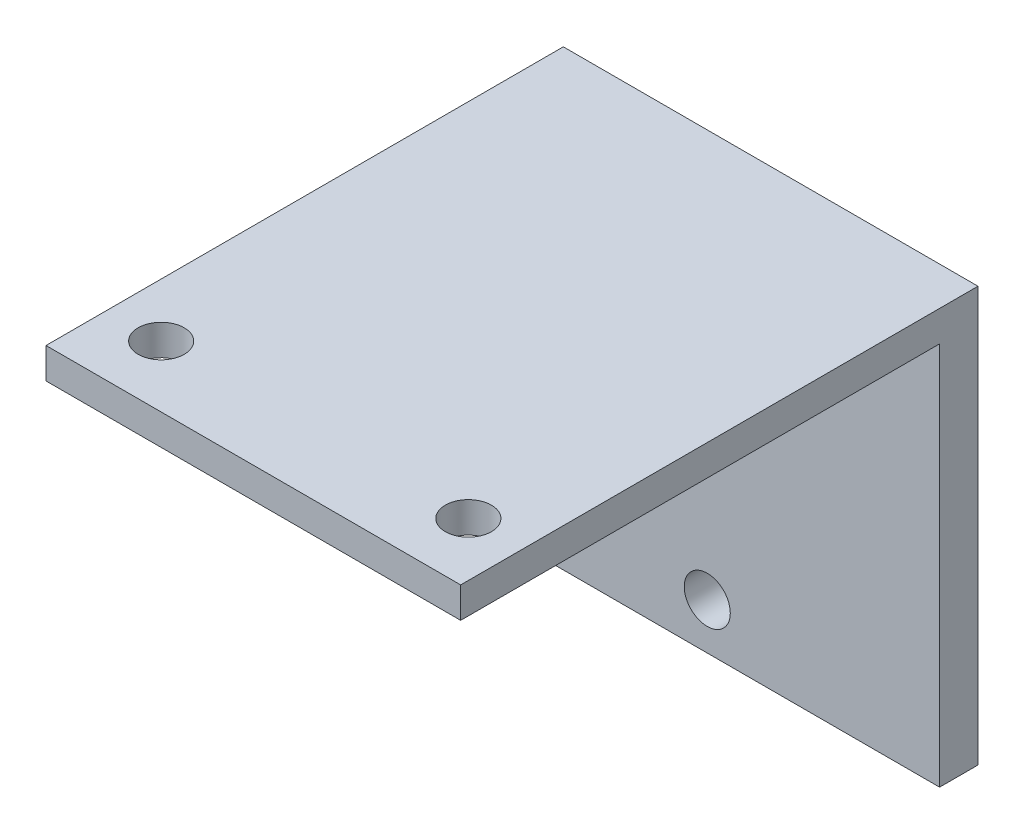
ISO-10303-21;
HEADER;
FILE_DESCRIPTION(('STEP AP214'),'2;1');
FILE_NAME('part.step','',(''),(''),'','','');
FILE_SCHEMA(('AUTOMOTIVE_DESIGN { 1 0 10303 214 1 1 1 1 }'));
ENDSEC;
DATA;
#1=APPLICATION_CONTEXT('core data for automotive mechanical design processes');
#2=APPLICATION_PROTOCOL_DEFINITION('international standard','automotive_design',2000,#1);
#3=PRODUCT_CONTEXT('',#1,'mechanical');
#4=PRODUCT('Part','Part','',(#3));
#5=PRODUCT_RELATED_PRODUCT_CATEGORY('part','',(#4));
#6=PRODUCT_DEFINITION_FORMATION('','',#4);
#7=PRODUCT_DEFINITION_CONTEXT('part definition',#1,'design');
#8=PRODUCT_DEFINITION('design','',#6,#7);
#9=PRODUCT_DEFINITION_SHAPE('','',#8);
#10=(LENGTH_UNIT() NAMED_UNIT(*) SI_UNIT(.MILLI.,.METRE.));
#11=(NAMED_UNIT(*) PLANE_ANGLE_UNIT() SI_UNIT($,.RADIAN.));
#12=(NAMED_UNIT(*) SI_UNIT($,.STERADIAN.) SOLID_ANGLE_UNIT());
#13=UNCERTAINTY_MEASURE_WITH_UNIT(LENGTH_MEASURE(1.E-05),#10,'distance_accuracy_value','');
#14=(GEOMETRIC_REPRESENTATION_CONTEXT(3) GLOBAL_UNCERTAINTY_ASSIGNED_CONTEXT((#13)) GLOBAL_UNIT_ASSIGNED_CONTEXT((#10,
#11,#12)) REPRESENTATION_CONTEXT('',''));
#15=CARTESIAN_POINT('',(0.,0.,0.));
#16=DIRECTION('',(0.,0.,1.));
#17=DIRECTION('',(1.,0.,0.));
#18=AXIS2_PLACEMENT_3D('',#15,#16,#17);
#19=CARTESIAN_POINT('',(0.,-27.,67.37));
#20=DIRECTION('',(0.,1.,0.));
#21=DIRECTION('',(0.,0.,1.));
#22=AXIS2_PLACEMENT_3D('',#19,#20,#21);
#23=PLANE('',#22);
#24=DIRECTION('',(1.,0.,0.));
#25=VECTOR('',#24,1.);
#26=CARTESIAN_POINT('',(0.,-27.,5.));
#27=LINE('',#26,#25);
#28=CARTESIAN_POINT('',(-27.,-27.,5.));
#29=VERTEX_POINT('',#28);
#30=CARTESIAN_POINT('',(27.,-27.,5.));
#31=VERTEX_POINT('',#30);
#32=EDGE_CURVE('E132',#29,#31,#27,.T.);
#33=ORIENTED_EDGE('',*,*,#32,.F.);
#34=DIRECTION('',(0.,0.,-1.));
#35=VECTOR('',#34,1.);
#36=CARTESIAN_POINT('',(-27.,-27.,67.37));
#37=LINE('',#36,#35);
#38=CARTESIAN_POINT('',(-27.,-27.,0.));
#39=VERTEX_POINT('',#38);
#40=EDGE_CURVE('E118',#29,#39,#37,.T.);
#41=ORIENTED_EDGE('',*,*,#40,.T.);
#42=DIRECTION('',(1.,0.,0.));
#43=VECTOR('',#42,1.);
#44=CARTESIAN_POINT('',(0.,-27.,0.));
#45=LINE('',#44,#43);
#46=CARTESIAN_POINT('',(27.,-27.,0.));
#47=VERTEX_POINT('',#46);
#48=EDGE_CURVE('E96',#39,#47,#45,.T.);
#49=ORIENTED_EDGE('',*,*,#48,.T.);
#50=DIRECTION('',(0.,0.,-1.));
#51=VECTOR('',#50,1.);
#52=CARTESIAN_POINT('',(27.,-27.,67.37));
#53=LINE('',#52,#51);
#54=EDGE_CURVE('E85',#31,#47,#53,.T.);
#55=ORIENTED_EDGE('',*,*,#54,.F.);
#56=EDGE_LOOP('',(#33,#41,#49,#55));
#57=FACE_BOUND('',#56,.T.);
#58=ADVANCED_FACE('F34',(#57),#23,.F.);
#59=CARTESIAN_POINT('',(-3.25809932409174,-21.,67.37));
#60=DIRECTION('',(0.,0.,-1.));
#61=DIRECTION('',(-1.,0.,0.));
#62=AXIS2_PLACEMENT_3D('',#59,#60,#61);
#63=CYLINDRICAL_SURFACE('',#62,3.);
#64=CARTESIAN_POINT('',(-3.25809932409174,-21.,0.));
#65=DIRECTION('',(0.,0.,1.));
#66=DIRECTION('',(1.,0.,0.));
#67=AXIS2_PLACEMENT_3D('',#64,#65,#66);
#68=CIRCLE('',#67,3.);
#69=CARTESIAN_POINT('',(-0.258099324091737,-21.,0.));
#70=VERTEX_POINT('',#69);
#71=EDGE_CURVE('E95',#70,#70,#68,.T.);
#72=ORIENTED_EDGE('',*,*,#71,.F.);
#73=EDGE_LOOP('',(#72));
#74=FACE_BOUND('',#73,.T.);
#75=CARTESIAN_POINT('',(-3.25809932409174,-21.,5.));
#76=DIRECTION('',(0.,0.,1.));
#77=DIRECTION('',(1.,0.,0.));
#78=AXIS2_PLACEMENT_3D('',#75,#76,#77);
#79=CIRCLE('',#78,3.);
#80=CARTESIAN_POINT('',(-0.258099324091737,-21.,5.));
#81=VERTEX_POINT('',#80);
#82=EDGE_CURVE('E102',#81,#81,#79,.T.);
#83=ORIENTED_EDGE('',*,*,#82,.T.);
#84=EDGE_LOOP('',(#83));
#85=FACE_BOUND('',#84,.T.);
#86=ADVANCED_FACE('F178',(#74,#85),#63,.F.);
#87=CARTESIAN_POINT('',(-3.25809932409216,19.,67.37));
#88=DIRECTION('',(0.,0.,-1.));
#89=DIRECTION('',(-1.,0.,0.));
#90=AXIS2_PLACEMENT_3D('',#87,#88,#89);
#91=CYLINDRICAL_SURFACE('',#90,3.);
#92=CARTESIAN_POINT('',(-3.25809932409216,19.,0.));
#93=DIRECTION('',(0.,0.,1.));
#94=DIRECTION('',(1.,0.,0.));
#95=AXIS2_PLACEMENT_3D('',#92,#93,#94);
#96=CIRCLE('',#95,3.);
#97=CARTESIAN_POINT('',(-0.258099324092156,19.,0.));
#98=VERTEX_POINT('',#97);
#99=EDGE_CURVE('E114',#98,#98,#96,.T.);
#100=ORIENTED_EDGE('',*,*,#99,.F.);
#101=EDGE_LOOP('',(#100));
#102=FACE_BOUND('',#101,.T.);
#103=CARTESIAN_POINT('',(-3.25809932409216,19.,5.));
#104=DIRECTION('',(0.,0.,1.));
#105=DIRECTION('',(1.,0.,0.));
#106=AXIS2_PLACEMENT_3D('',#103,#104,#105);
#107=CIRCLE('',#106,3.);
#108=CARTESIAN_POINT('',(-0.258099324092156,19.,5.));
#109=VERTEX_POINT('',#108);
#110=EDGE_CURVE('E38',#109,#109,#107,.T.);
#111=ORIENTED_EDGE('',*,*,#110,.T.);
#112=EDGE_LOOP('',(#111));
#113=FACE_BOUND('',#112,.T.);
#114=ADVANCED_FACE('F183',(#102,#113),#91,.F.);
#115=CARTESIAN_POINT('',(0.,27.,67.37));
#116=DIRECTION('',(0.,1.,0.));
#117=DIRECTION('',(0.,0.,1.));
#118=AXIS2_PLACEMENT_3D('',#115,#116,#117);
#119=PLANE('',#118);
#120=CARTESIAN_POINT('',(20.,27.,59.37));
#121=DIRECTION('',(0.,1.,0.));
#122=DIRECTION('',(0.,0.,1.));
#123=AXIS2_PLACEMENT_3D('',#120,#121,#122);
#124=CIRCLE('',#123,3.);
#125=CARTESIAN_POINT('',(20.,27.,62.37));
#126=VERTEX_POINT('',#125);
#127=EDGE_CURVE('E151',#126,#126,#124,.T.);
#128=ORIENTED_EDGE('',*,*,#127,.F.);
#129=EDGE_LOOP('',(#128));
#130=FACE_BOUND('',#129,.T.);
#131=CARTESIAN_POINT('',(-20.,27.,59.37));
#132=DIRECTION('',(0.,1.,0.));
#133=DIRECTION('',(0.,0.,1.));
#134=AXIS2_PLACEMENT_3D('',#131,#132,#133);
#135=CIRCLE('',#134,3.);
#136=CARTESIAN_POINT('',(-20.,27.,62.37));
#137=VERTEX_POINT('',#136);
#138=EDGE_CURVE('E145',#137,#137,#135,.T.);
#139=ORIENTED_EDGE('',*,*,#138,.F.);
#140=EDGE_LOOP('',(#139));
#141=FACE_BOUND('',#140,.T.);
#142=DIRECTION('',(1.,0.,0.));
#143=VECTOR('',#142,1.);
#144=CARTESIAN_POINT('',(0.,27.,0.));
#145=LINE('',#144,#143);
#146=CARTESIAN_POINT('',(-27.,27.,0.));
#147=VERTEX_POINT('',#146);
#148=CARTESIAN_POINT('',(27.,27.,0.));
#149=VERTEX_POINT('',#148);
#150=EDGE_CURVE('E81',#147,#149,#145,.T.);
#151=ORIENTED_EDGE('',*,*,#150,.F.);
#152=DIRECTION('',(0.,0.,-1.));
#153=VECTOR('',#152,1.);
#154=CARTESIAN_POINT('',(-27.,27.,67.37));
#155=LINE('',#154,#153);
#156=CARTESIAN_POINT('',(-27.,27.,67.37));
#157=VERTEX_POINT('',#156);
#158=EDGE_CURVE('E43',#157,#147,#155,.T.);
#159=ORIENTED_EDGE('',*,*,#158,.F.);
#160=DIRECTION('',(1.,0.,0.));
#161=VECTOR('',#160,1.);
#162=CARTESIAN_POINT('',(0.,27.,67.37));
#163=LINE('',#162,#161);
#164=CARTESIAN_POINT('',(27.,27.,67.37));
#165=VERTEX_POINT('',#164);
#166=EDGE_CURVE('E83',#157,#165,#163,.T.);
#167=ORIENTED_EDGE('',*,*,#166,.T.);
#168=DIRECTION('',(0.,0.,-1.));
#169=VECTOR('',#168,1.);
#170=CARTESIAN_POINT('',(27.,27.,67.37));
#171=LINE('',#170,#169);
#172=EDGE_CURVE('E77',#165,#149,#171,.T.);
#173=ORIENTED_EDGE('',*,*,#172,.T.);
#174=EDGE_LOOP('',(#151,#159,#167,#173));
#175=FACE_BOUND('',#174,.T.);
#176=ADVANCED_FACE('F36',(#130,#141,#175),#119,.T.);
#177=CARTESIAN_POINT('',(-27.,0.,67.37));
#178=DIRECTION('',(-1.,0.,0.));
#179=DIRECTION('',(0.,0.,1.));
#180=AXIS2_PLACEMENT_3D('',#177,#178,#179);
#181=PLANE('',#180);
#182=DIRECTION('',(0.,0.,-1.));
#183=VECTOR('',#182,1.);
#184=CARTESIAN_POINT('',(-27.,23.,67.37));
#185=LINE('',#184,#183);
#186=CARTESIAN_POINT('',(-27.,23.,67.37));
#187=VERTEX_POINT('',#186);
#188=CARTESIAN_POINT('',(-27.,23.,5.));
#189=VERTEX_POINT('',#188);
#190=EDGE_CURVE('E138',#187,#189,#185,.T.);
#191=ORIENTED_EDGE('',*,*,#190,.F.);
#192=DIRECTION('',(0.,1.,0.));
#193=VECTOR('',#192,1.);
#194=CARTESIAN_POINT('',(-27.,0.,67.37));
#195=LINE('',#194,#193);
#196=EDGE_CURVE('E125',#187,#157,#195,.T.);
#197=ORIENTED_EDGE('',*,*,#196,.T.);
#198=ORIENTED_EDGE('',*,*,#158,.T.);
#199=DIRECTION('',(0.,1.,0.));
#200=VECTOR('',#199,1.);
#201=CARTESIAN_POINT('',(-27.,0.,0.));
#202=LINE('',#201,#200);
#203=EDGE_CURVE('E101',#39,#147,#202,.T.);
#204=ORIENTED_EDGE('',*,*,#203,.F.);
#205=ORIENTED_EDGE('',*,*,#40,.F.);
#206=DIRECTION('',(0.,1.,0.));
#207=VECTOR('',#206,1.);
#208=CARTESIAN_POINT('',(-27.,0.,5.));
#209=LINE('',#208,#207);
#210=EDGE_CURVE('E106',#29,#189,#209,.T.);
#211=ORIENTED_EDGE('',*,*,#210,.T.);
#212=EDGE_LOOP('',(#191,#197,#198,#204,#205,#211));
#213=FACE_BOUND('',#212,.T.);
#214=ADVANCED_FACE('F122',(#213),#181,.T.);
#215=CARTESIAN_POINT('',(27.,0.,67.37));
#216=DIRECTION('',(-1.,0.,0.));
#217=DIRECTION('',(0.,0.,1.));
#218=AXIS2_PLACEMENT_3D('',#215,#216,#217);
#219=PLANE('',#218);
#220=DIRECTION('',(0.,1.,0.));
#221=VECTOR('',#220,1.);
#222=CARTESIAN_POINT('',(27.,0.,67.37));
#223=LINE('',#222,#221);
#224=CARTESIAN_POINT('',(27.,23.,67.37));
#225=VERTEX_POINT('',#224);
#226=EDGE_CURVE('E57',#225,#165,#223,.T.);
#227=ORIENTED_EDGE('',*,*,#226,.F.);
#228=DIRECTION('',(0.,0.,-1.));
#229=VECTOR('',#228,1.);
#230=CARTESIAN_POINT('',(27.,23.,67.37));
#231=LINE('',#230,#229);
#232=CARTESIAN_POINT('',(27.,23.,5.));
#233=VERTEX_POINT('',#232);
#234=EDGE_CURVE('E49',#225,#233,#231,.T.);
#235=ORIENTED_EDGE('',*,*,#234,.T.);
#236=DIRECTION('',(0.,1.,0.));
#237=VECTOR('',#236,1.);
#238=CARTESIAN_POINT('',(27.,0.,5.));
#239=LINE('',#238,#237);
#240=EDGE_CURVE('E135',#31,#233,#239,.T.);
#241=ORIENTED_EDGE('',*,*,#240,.F.);
#242=ORIENTED_EDGE('',*,*,#54,.T.);
#243=DIRECTION('',(0.,1.,0.));
#244=VECTOR('',#243,1.);
#245=CARTESIAN_POINT('',(27.,0.,0.));
#246=LINE('',#245,#244);
#247=EDGE_CURVE('E88',#47,#149,#246,.T.);
#248=ORIENTED_EDGE('',*,*,#247,.T.);
#249=ORIENTED_EDGE('',*,*,#172,.F.);
#250=EDGE_LOOP('',(#227,#235,#241,#242,#248,#249));
#251=FACE_BOUND('',#250,.T.);
#252=ADVANCED_FACE('F89',(#251),#219,.F.);
#253=CARTESIAN_POINT('',(0.,0.,67.37));
#254=DIRECTION('',(0.,0.,1.));
#255=DIRECTION('',(1.,0.,0.));
#256=AXIS2_PLACEMENT_3D('',#253,#254,#255);
#257=PLANE('',#256);
#258=DIRECTION('',(-1.,0.,0.));
#259=VECTOR('',#258,1.);
#260=CARTESIAN_POINT('',(0.,23.,67.37));
#261=LINE('',#260,#259);
#262=EDGE_CURVE('E11',#225,#187,#261,.T.);
#263=ORIENTED_EDGE('',*,*,#262,.F.);
#264=ORIENTED_EDGE('',*,*,#226,.T.);
#265=ORIENTED_EDGE('',*,*,#166,.F.);
#266=ORIENTED_EDGE('',*,*,#196,.F.);
#267=EDGE_LOOP('',(#263,#264,#265,#266));
#268=FACE_BOUND('',#267,.T.);
#269=ADVANCED_FACE('F126',(#268),#257,.T.);
#270=CARTESIAN_POINT('',(0.,0.,0.));
#271=DIRECTION('',(0.,0.,1.));
#272=DIRECTION('',(1.,0.,0.));
#273=AXIS2_PLACEMENT_3D('',#270,#271,#272);
#274=PLANE('',#273);
#275=ORIENTED_EDGE('',*,*,#150,.T.);
#276=ORIENTED_EDGE('',*,*,#247,.F.);
#277=ORIENTED_EDGE('',*,*,#48,.F.);
#278=ORIENTED_EDGE('',*,*,#203,.T.);
#279=EDGE_LOOP('',(#275,#276,#277,#278));
#280=FACE_BOUND('',#279,.T.);
#281=ORIENTED_EDGE('',*,*,#71,.T.);
#282=EDGE_LOOP('',(#281));
#283=FACE_BOUND('',#282,.T.);
#284=ORIENTED_EDGE('',*,*,#99,.T.);
#285=EDGE_LOOP('',(#284));
#286=FACE_BOUND('',#285,.T.);
#287=ADVANCED_FACE('F98',(#280,#283,#286),#274,.F.);
#288=CARTESIAN_POINT('',(38.7750425347235,23.,5.));
#289=DIRECTION('',(0.,1.,0.));
#290=DIRECTION('',(0.,0.,1.));
#291=AXIS2_PLACEMENT_3D('',#288,#289,#290);
#292=PLANE('',#291);
#293=CARTESIAN_POINT('',(20.,23.,59.37));
#294=DIRECTION('',(0.,-1.,0.));
#295=DIRECTION('',(0.,0.,-1.));
#296=AXIS2_PLACEMENT_3D('',#293,#294,#295);
#297=CIRCLE('',#296,3.);
#298=CARTESIAN_POINT('',(20.,23.,56.37));
#299=VERTEX_POINT('',#298);
#300=EDGE_CURVE('E154',#299,#299,#297,.T.);
#301=ORIENTED_EDGE('',*,*,#300,.F.);
#302=EDGE_LOOP('',(#301));
#303=FACE_BOUND('',#302,.T.);
#304=CARTESIAN_POINT('',(-20.,23.,59.37));
#305=DIRECTION('',(0.,-1.,0.));
#306=DIRECTION('',(0.,0.,-1.));
#307=AXIS2_PLACEMENT_3D('',#304,#305,#306);
#308=CIRCLE('',#307,3.);
#309=CARTESIAN_POINT('',(-20.,23.,56.37));
#310=VERTEX_POINT('',#309);
#311=EDGE_CURVE('E148',#310,#310,#308,.T.);
#312=ORIENTED_EDGE('',*,*,#311,.F.);
#313=EDGE_LOOP('',(#312));
#314=FACE_BOUND('',#313,.T.);
#315=ORIENTED_EDGE('',*,*,#190,.T.);
#316=DIRECTION('',(-1.,0.,0.));
#317=VECTOR('',#316,1.);
#318=CARTESIAN_POINT('',(38.7750425347235,23.,5.));
#319=LINE('',#318,#317);
#320=EDGE_CURVE('E142',#233,#189,#319,.T.);
#321=ORIENTED_EDGE('',*,*,#320,.F.);
#322=ORIENTED_EDGE('',*,*,#234,.F.);
#323=ORIENTED_EDGE('',*,*,#262,.T.);
#324=EDGE_LOOP('',(#315,#321,#322,#323));
#325=FACE_BOUND('',#324,.T.);
#326=ADVANCED_FACE('F160',(#303,#314,#325),#292,.F.);
#327=CARTESIAN_POINT('',(0.,0.,5.));
#328=DIRECTION('',(0.,0.,1.));
#329=DIRECTION('',(1.,0.,0.));
#330=AXIS2_PLACEMENT_3D('',#327,#328,#329);
#331=PLANE('',#330);
#332=ORIENTED_EDGE('',*,*,#82,.F.);
#333=EDGE_LOOP('',(#332));
#334=FACE_BOUND('',#333,.T.);
#335=ORIENTED_EDGE('',*,*,#110,.F.);
#336=EDGE_LOOP('',(#335));
#337=FACE_BOUND('',#336,.T.);
#338=ORIENTED_EDGE('',*,*,#32,.T.);
#339=ORIENTED_EDGE('',*,*,#240,.T.);
#340=ORIENTED_EDGE('',*,*,#320,.T.);
#341=ORIENTED_EDGE('',*,*,#210,.F.);
#342=EDGE_LOOP('',(#338,#339,#340,#341));
#343=FACE_BOUND('',#342,.T.);
#344=ADVANCED_FACE('F163',(#334,#337,#343),#331,.T.);
#345=CARTESIAN_POINT('',(-20.,85.37,59.37));
#346=DIRECTION('',(0.,-1.,0.));
#347=DIRECTION('',(0.,0.,-1.));
#348=AXIS2_PLACEMENT_3D('',#345,#346,#347);
#349=CYLINDRICAL_SURFACE('',#348,3.);
#350=ORIENTED_EDGE('',*,*,#138,.T.);
#351=EDGE_LOOP('',(#350));
#352=FACE_BOUND('',#351,.T.);
#353=ORIENTED_EDGE('',*,*,#311,.T.);
#354=EDGE_LOOP('',(#353));
#355=FACE_BOUND('',#354,.T.);
#356=ADVANCED_FACE('F202',(#352,#355),#349,.F.);
#357=CARTESIAN_POINT('',(20.,85.37,59.37));
#358=DIRECTION('',(0.,-1.,0.));
#359=DIRECTION('',(0.,0.,-1.));
#360=AXIS2_PLACEMENT_3D('',#357,#358,#359);
#361=CYLINDRICAL_SURFACE('',#360,3.);
#362=ORIENTED_EDGE('',*,*,#127,.T.);
#363=EDGE_LOOP('',(#362));
#364=FACE_BOUND('',#363,.T.);
#365=ORIENTED_EDGE('',*,*,#300,.T.);
#366=EDGE_LOOP('',(#365));
#367=FACE_BOUND('',#366,.T.);
#368=ADVANCED_FACE('F158',(#364,#367),#361,.F.);
#369=CLOSED_SHELL('',(#58,#86,#114,#176,#214,#252,#269,#287,#326,#344,#356,#368));
#370=MANIFOLD_SOLID_BREP('B2',#369);
#371=ADVANCED_BREP_SHAPE_REPRESENTATION('',(#18,#370),#14);
#372=SHAPE_DEFINITION_REPRESENTATION(#9,#371);
ENDSEC;
END-ISO-10303-21;
